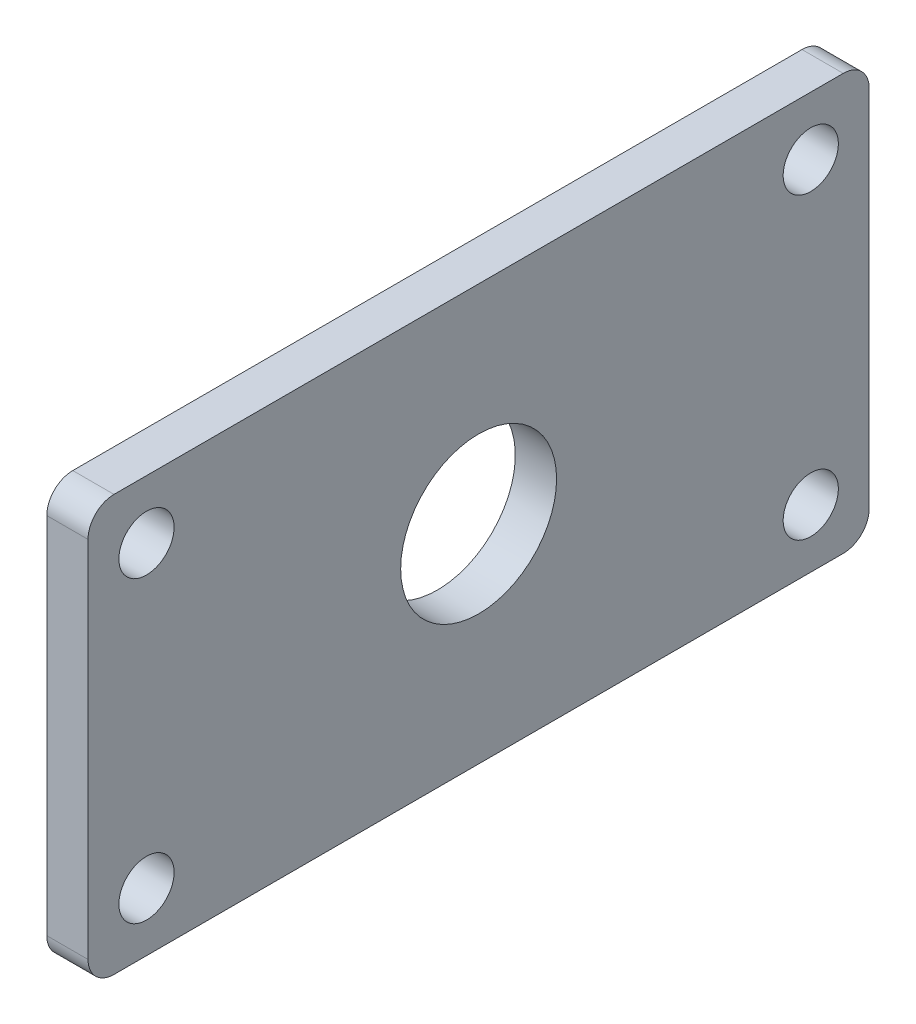
ISO-10303-21;
HEADER;
FILE_DESCRIPTION(('STEP AP214'),'2;1');
FILE_NAME('part.step','',(''),(''),'','','');
FILE_SCHEMA(('AUTOMOTIVE_DESIGN { 1 0 10303 214 1 1 1 1 }'));
ENDSEC;
DATA;
#1=APPLICATION_CONTEXT('core data for automotive mechanical design processes');
#2=APPLICATION_PROTOCOL_DEFINITION('international standard','automotive_design',2000,#1);
#3=PRODUCT_CONTEXT('',#1,'mechanical');
#4=PRODUCT('Part','Part','',(#3));
#5=PRODUCT_RELATED_PRODUCT_CATEGORY('part','',(#4));
#6=PRODUCT_DEFINITION_FORMATION('','',#4);
#7=PRODUCT_DEFINITION_CONTEXT('part definition',#1,'design');
#8=PRODUCT_DEFINITION('design','',#6,#7);
#9=PRODUCT_DEFINITION_SHAPE('','',#8);
#10=(LENGTH_UNIT() NAMED_UNIT(*) SI_UNIT(.MILLI.,.METRE.));
#11=(NAMED_UNIT(*) PLANE_ANGLE_UNIT() SI_UNIT($,.RADIAN.));
#12=(NAMED_UNIT(*) SI_UNIT($,.STERADIAN.) SOLID_ANGLE_UNIT());
#13=UNCERTAINTY_MEASURE_WITH_UNIT(LENGTH_MEASURE(1.E-05),#10,'distance_accuracy_value','');
#14=(GEOMETRIC_REPRESENTATION_CONTEXT(3) GLOBAL_UNCERTAINTY_ASSIGNED_CONTEXT((#13)) GLOBAL_UNIT_ASSIGNED_CONTEXT((#10,
#11,#12)) REPRESENTATION_CONTEXT('',''));
#15=CARTESIAN_POINT('',(0.,0.,0.));
#16=DIRECTION('',(0.,0.,1.));
#17=DIRECTION('',(1.,0.,0.));
#18=AXIS2_PLACEMENT_3D('',#15,#16,#17);
#19=CARTESIAN_POINT('',(44.075,0.,30.0625));
#20=DIRECTION('',(1.,0.,0.));
#21=DIRECTION('',(0.,0.,-1.));
#22=AXIS2_PLACEMENT_3D('',#19,#20,#21);
#23=PLANE('',#22);
#24=CARTESIAN_POINT('',(44.075,0.,0.));
#25=DIRECTION('',(1.,0.,0.));
#26=DIRECTION('',(0.,0.,-1.));
#27=AXIS2_PLACEMENT_3D('',#24,#25,#26);
#28=CIRCLE('',#27,6.);
#29=CARTESIAN_POINT('',(44.075,0.,-6.));
#30=VERTEX_POINT('',#29);
#31=EDGE_CURVE('E176',#30,#30,#28,.T.);
#32=ORIENTED_EDGE('',*,*,#31,.F.);
#33=EDGE_LOOP('',(#32));
#34=FACE_BOUND('',#33,.T.);
#35=CARTESIAN_POINT('',(44.075,-11.5,25.5625));
#36=DIRECTION('',(1.,0.,0.));
#37=DIRECTION('',(0.,0.,-1.));
#38=AXIS2_PLACEMENT_3D('',#35,#36,#37);
#39=CIRCLE('',#38,2.125);
#40=CARTESIAN_POINT('',(44.075,-11.5,23.4375));
#41=VERTEX_POINT('',#40);
#42=EDGE_CURVE('E267',#41,#41,#39,.T.);
#43=ORIENTED_EDGE('',*,*,#42,.F.);
#44=EDGE_LOOP('',(#43));
#45=FACE_BOUND('',#44,.T.);
#46=CARTESIAN_POINT('',(44.075,-11.5,-25.5625));
#47=DIRECTION('',(1.,0.,0.));
#48=DIRECTION('',(0.,0.,-1.));
#49=AXIS2_PLACEMENT_3D('',#46,#47,#48);
#50=CIRCLE('',#49,2.125);
#51=CARTESIAN_POINT('',(44.075,-11.5,-27.6875));
#52=VERTEX_POINT('',#51);
#53=EDGE_CURVE('E264',#52,#52,#50,.T.);
#54=ORIENTED_EDGE('',*,*,#53,.F.);
#55=EDGE_LOOP('',(#54));
#56=FACE_BOUND('',#55,.T.);
#57=CARTESIAN_POINT('',(44.075,11.5,-25.5625));
#58=DIRECTION('',(1.,0.,0.));
#59=DIRECTION('',(0.,0.,-1.));
#60=AXIS2_PLACEMENT_3D('',#57,#58,#59);
#61=CIRCLE('',#60,2.12500000000001);
#62=CARTESIAN_POINT('',(44.075,11.5,-27.6875));
#63=VERTEX_POINT('',#62);
#64=EDGE_CURVE('E241',#63,#63,#61,.T.);
#65=ORIENTED_EDGE('',*,*,#64,.F.);
#66=EDGE_LOOP('',(#65));
#67=FACE_BOUND('',#66,.T.);
#68=CARTESIAN_POINT('',(44.075,11.5,25.5625));
#69=DIRECTION('',(1.,0.,0.));
#70=DIRECTION('',(0.,0.,-1.));
#71=AXIS2_PLACEMENT_3D('',#68,#69,#70);
#72=CIRCLE('',#71,2.125);
#73=CARTESIAN_POINT('',(44.075,11.5,23.4375));
#74=VERTEX_POINT('',#73);
#75=EDGE_CURVE('E250',#74,#74,#72,.T.);
#76=ORIENTED_EDGE('',*,*,#75,.F.);
#77=EDGE_LOOP('',(#76));
#78=FACE_BOUND('',#77,.T.);
#79=DIRECTION('',(0.,-1.,0.));
#80=VECTOR('',#79,1.);
#81=CARTESIAN_POINT('',(44.075,0.,30.0625));
#82=LINE('',#81,#80);
#83=CARTESIAN_POINT('',(44.075,14.,30.0625));
#84=VERTEX_POINT('',#83);
#85=CARTESIAN_POINT('',(44.075,-14.,30.0625));
#86=VERTEX_POINT('',#85);
#87=EDGE_CURVE('E172',#84,#86,#82,.T.);
#88=ORIENTED_EDGE('',*,*,#87,.T.);
#89=CARTESIAN_POINT('',(44.075,-14.,28.0625));
#90=DIRECTION('',(1.,0.,0.));
#91=DIRECTION('',(0.,0.,-1.));
#92=AXIS2_PLACEMENT_3D('',#89,#90,#91);
#93=CIRCLE('',#92,2.);
#94=CARTESIAN_POINT('',(44.075,-16.,28.0625));
#95=VERTEX_POINT('',#94);
#96=EDGE_CURVE('E156',#86,#95,#93,.T.);
#97=ORIENTED_EDGE('',*,*,#96,.T.);
#98=DIRECTION('',(0.,0.,-1.));
#99=VECTOR('',#98,1.);
#100=CARTESIAN_POINT('',(44.075,-16.,30.0625));
#101=LINE('',#100,#99);
#102=CARTESIAN_POINT('',(44.075,-16.,-28.0625));
#103=VERTEX_POINT('',#102);
#104=EDGE_CURVE('E127',#95,#103,#101,.T.);
#105=ORIENTED_EDGE('',*,*,#104,.T.);
#106=CARTESIAN_POINT('',(44.075,-14.,-28.0625));
#107=DIRECTION('',(1.,0.,0.));
#108=DIRECTION('',(0.,0.,-1.));
#109=AXIS2_PLACEMENT_3D('',#106,#107,#108);
#110=CIRCLE('',#109,2.);
#111=CARTESIAN_POINT('',(44.075,-14.,-30.0625));
#112=VERTEX_POINT('',#111);
#113=EDGE_CURVE('E154',#103,#112,#110,.T.);
#114=ORIENTED_EDGE('',*,*,#113,.T.);
#115=DIRECTION('',(0.,-1.,0.));
#116=VECTOR('',#115,1.);
#117=CARTESIAN_POINT('',(44.075,0.,-30.0625));
#118=LINE('',#117,#116);
#119=CARTESIAN_POINT('',(44.075,14.,-30.0625));
#120=VERTEX_POINT('',#119);
#121=EDGE_CURVE('E169',#120,#112,#118,.T.);
#122=ORIENTED_EDGE('',*,*,#121,.F.);
#123=CARTESIAN_POINT('',(44.075,14.,-28.0625));
#124=DIRECTION('',(1.,0.,0.));
#125=DIRECTION('',(0.,0.,-1.));
#126=AXIS2_PLACEMENT_3D('',#123,#124,#125);
#127=CIRCLE('',#126,2.);
#128=CARTESIAN_POINT('',(44.075,16.,-28.0625));
#129=VERTEX_POINT('',#128);
#130=EDGE_CURVE('E56',#120,#129,#127,.T.);
#131=ORIENTED_EDGE('',*,*,#130,.T.);
#132=DIRECTION('',(0.,0.,-1.));
#133=VECTOR('',#132,1.);
#134=CARTESIAN_POINT('',(44.075,16.,30.0625));
#135=LINE('',#134,#133);
#136=CARTESIAN_POINT('',(44.075,16.,28.0625));
#137=VERTEX_POINT('',#136);
#138=EDGE_CURVE('E136',#137,#129,#135,.T.);
#139=ORIENTED_EDGE('',*,*,#138,.F.);
#140=CARTESIAN_POINT('',(44.075,14.,28.0625));
#141=DIRECTION('',(1.,0.,0.));
#142=DIRECTION('',(0.,0.,-1.));
#143=AXIS2_PLACEMENT_3D('',#140,#141,#142);
#144=CIRCLE('',#143,2.);
#145=EDGE_CURVE('E151',#137,#84,#144,.T.);
#146=ORIENTED_EDGE('',*,*,#145,.T.);
#147=EDGE_LOOP('',(#88,#97,#105,#114,#122,#131,#139,#146));
#148=FACE_BOUND('',#147,.T.);
#149=ADVANCED_FACE('F41',(#34,#45,#56,#67,#78,#148),#23,.T.);
#150=CARTESIAN_POINT('',(0.,16.,30.0625));
#151=DIRECTION('',(0.,-1.,0.));
#152=DIRECTION('',(0.,0.,-1.));
#153=AXIS2_PLACEMENT_3D('',#150,#151,#152);
#154=PLANE('',#153);
#155=ORIENTED_EDGE('',*,*,#138,.T.);
#156=DIRECTION('',(-1.,0.,0.));
#157=VECTOR('',#156,1.);
#158=CARTESIAN_POINT('',(0.,16.,-28.0625));
#159=LINE('',#158,#157);
#160=CARTESIAN_POINT('',(40.9,16.,-28.0625));
#161=VERTEX_POINT('',#160);
#162=EDGE_CURVE('E11',#129,#161,#159,.T.);
#163=ORIENTED_EDGE('',*,*,#162,.T.);
#164=DIRECTION('',(0.,0.,-1.));
#165=VECTOR('',#164,1.);
#166=CARTESIAN_POINT('',(40.9,16.,30.0625));
#167=LINE('',#166,#165);
#168=CARTESIAN_POINT('',(40.9,16.,28.0625));
#169=VERTEX_POINT('',#168);
#170=EDGE_CURVE('E133',#169,#161,#167,.T.);
#171=ORIENTED_EDGE('',*,*,#170,.F.);
#172=DIRECTION('',(-1.,0.,0.));
#173=VECTOR('',#172,1.);
#174=CARTESIAN_POINT('',(44.075,16.,28.0625));
#175=LINE('',#174,#173);
#176=EDGE_CURVE('E49',#169,#137,#175,.F.);
#177=ORIENTED_EDGE('',*,*,#176,.T.);
#178=EDGE_LOOP('',(#155,#163,#171,#177));
#179=FACE_BOUND('',#178,.T.);
#180=ADVANCED_FACE('F184',(#179),#154,.F.);
#181=CARTESIAN_POINT('',(40.9,0.,30.0625));
#182=DIRECTION('',(1.,0.,0.));
#183=DIRECTION('',(0.,0.,-1.));
#184=AXIS2_PLACEMENT_3D('',#181,#182,#183);
#185=PLANE('',#184);
#186=CARTESIAN_POINT('',(40.9,0.,0.));
#187=DIRECTION('',(-1.,0.,0.));
#188=DIRECTION('',(0.,0.,1.));
#189=AXIS2_PLACEMENT_3D('',#186,#187,#188);
#190=CIRCLE('',#189,6.);
#191=CARTESIAN_POINT('',(40.9,0.,6.));
#192=VERTEX_POINT('',#191);
#193=EDGE_CURVE('E258',#192,#192,#190,.T.);
#194=ORIENTED_EDGE('',*,*,#193,.F.);
#195=EDGE_LOOP('',(#194));
#196=FACE_BOUND('',#195,.T.);
#197=CARTESIAN_POINT('',(40.9,-11.5,25.5625));
#198=DIRECTION('',(-1.,0.,0.));
#199=DIRECTION('',(0.,0.,1.));
#200=AXIS2_PLACEMENT_3D('',#197,#198,#199);
#201=CIRCLE('',#200,2.125);
#202=CARTESIAN_POINT('',(40.9,-11.5,27.6875));
#203=VERTEX_POINT('',#202);
#204=EDGE_CURVE('E253',#203,#203,#201,.T.);
#205=ORIENTED_EDGE('',*,*,#204,.F.);
#206=EDGE_LOOP('',(#205));
#207=FACE_BOUND('',#206,.T.);
#208=CARTESIAN_POINT('',(40.9,-11.5,-25.5625));
#209=DIRECTION('',(-1.,0.,0.));
#210=DIRECTION('',(0.,0.,1.));
#211=AXIS2_PLACEMENT_3D('',#208,#209,#210);
#212=CIRCLE('',#211,2.125);
#213=CARTESIAN_POINT('',(40.9,-11.5,-23.4375));
#214=VERTEX_POINT('',#213);
#215=EDGE_CURVE('E247',#214,#214,#212,.T.);
#216=ORIENTED_EDGE('',*,*,#215,.F.);
#217=EDGE_LOOP('',(#216));
#218=FACE_BOUND('',#217,.T.);
#219=CARTESIAN_POINT('',(40.9,11.5,-25.5625));
#220=DIRECTION('',(-1.,0.,0.));
#221=DIRECTION('',(0.,0.,1.));
#222=AXIS2_PLACEMENT_3D('',#219,#220,#221);
#223=CIRCLE('',#222,2.12500000000001);
#224=CARTESIAN_POINT('',(40.9,11.5,-23.4375));
#225=VERTEX_POINT('',#224);
#226=EDGE_CURVE('E244',#225,#225,#223,.T.);
#227=ORIENTED_EDGE('',*,*,#226,.F.);
#228=EDGE_LOOP('',(#227));
#229=FACE_BOUND('',#228,.T.);
#230=CARTESIAN_POINT('',(40.9,11.5,25.5625));
#231=DIRECTION('',(-1.,0.,0.));
#232=DIRECTION('',(0.,0.,1.));
#233=AXIS2_PLACEMENT_3D('',#230,#231,#232);
#234=CIRCLE('',#233,2.125);
#235=CARTESIAN_POINT('',(40.9,11.5,27.6875));
#236=VERTEX_POINT('',#235);
#237=EDGE_CURVE('E246',#236,#236,#234,.T.);
#238=ORIENTED_EDGE('',*,*,#237,.F.);
#239=EDGE_LOOP('',(#238));
#240=FACE_BOUND('',#239,.T.);
#241=DIRECTION('',(0.,0.,-1.));
#242=VECTOR('',#241,1.);
#243=CARTESIAN_POINT('',(40.9,-16.,30.0625));
#244=LINE('',#243,#242);
#245=CARTESIAN_POINT('',(40.9,-16.,28.0625));
#246=VERTEX_POINT('',#245);
#247=CARTESIAN_POINT('',(40.9,-16.,-28.0625));
#248=VERTEX_POINT('',#247);
#249=EDGE_CURVE('E124',#246,#248,#244,.T.);
#250=ORIENTED_EDGE('',*,*,#249,.F.);
#251=CARTESIAN_POINT('',(40.9,-14.,28.0625));
#252=DIRECTION('',(1.,0.,0.));
#253=DIRECTION('',(0.,0.,-1.));
#254=AXIS2_PLACEMENT_3D('',#251,#252,#253);
#255=CIRCLE('',#254,2.);
#256=CARTESIAN_POINT('',(40.9,-14.,30.0625));
#257=VERTEX_POINT('',#256);
#258=EDGE_CURVE('E107',#246,#257,#255,.F.);
#259=ORIENTED_EDGE('',*,*,#258,.T.);
#260=DIRECTION('',(0.,-1.,0.));
#261=VECTOR('',#260,1.);
#262=CARTESIAN_POINT('',(40.9,0.,30.0625));
#263=LINE('',#262,#261);
#264=CARTESIAN_POINT('',(40.9,14.,30.0625));
#265=VERTEX_POINT('',#264);
#266=EDGE_CURVE('E138',#265,#257,#263,.T.);
#267=ORIENTED_EDGE('',*,*,#266,.F.);
#268=CARTESIAN_POINT('',(40.9,14.,28.0625));
#269=DIRECTION('',(1.,0.,0.));
#270=DIRECTION('',(0.,0.,-1.));
#271=AXIS2_PLACEMENT_3D('',#268,#269,#270);
#272=CIRCLE('',#271,2.);
#273=EDGE_CURVE('E128',#265,#169,#272,.F.);
#274=ORIENTED_EDGE('',*,*,#273,.T.);
#275=ORIENTED_EDGE('',*,*,#170,.T.);
#276=CARTESIAN_POINT('',(40.9,14.,-28.0625));
#277=DIRECTION('',(1.,0.,0.));
#278=DIRECTION('',(0.,0.,-1.));
#279=AXIS2_PLACEMENT_3D('',#276,#277,#278);
#280=CIRCLE('',#279,2.);
#281=CARTESIAN_POINT('',(40.9,14.,-30.0625));
#282=VERTEX_POINT('',#281);
#283=EDGE_CURVE('E145',#161,#282,#280,.F.);
#284=ORIENTED_EDGE('',*,*,#283,.T.);
#285=DIRECTION('',(0.,-1.,0.));
#286=VECTOR('',#285,1.);
#287=CARTESIAN_POINT('',(40.9,0.,-30.0625));
#288=LINE('',#287,#286);
#289=CARTESIAN_POINT('',(40.9,-14.,-30.0625));
#290=VERTEX_POINT('',#289);
#291=EDGE_CURVE('E167',#282,#290,#288,.T.);
#292=ORIENTED_EDGE('',*,*,#291,.T.);
#293=CARTESIAN_POINT('',(40.9,-14.,-28.0625));
#294=DIRECTION('',(1.,0.,0.));
#295=DIRECTION('',(0.,0.,-1.));
#296=AXIS2_PLACEMENT_3D('',#293,#294,#295);
#297=CIRCLE('',#296,2.);
#298=EDGE_CURVE('E118',#290,#248,#297,.F.);
#299=ORIENTED_EDGE('',*,*,#298,.T.);
#300=EDGE_LOOP('',(#250,#259,#267,#274,#275,#284,#292,#299));
#301=FACE_BOUND('',#300,.T.);
#302=ADVANCED_FACE('F131',(#196,#207,#218,#229,#240,#301),#185,.F.);
#303=CARTESIAN_POINT('',(0.,-16.,30.0625));
#304=DIRECTION('',(0.,-1.,0.));
#305=DIRECTION('',(0.,0.,-1.));
#306=AXIS2_PLACEMENT_3D('',#303,#304,#305);
#307=PLANE('',#306);
#308=ORIENTED_EDGE('',*,*,#104,.F.);
#309=DIRECTION('',(-1.,0.,0.));
#310=VECTOR('',#309,1.);
#311=CARTESIAN_POINT('',(0.,-16.,28.0625));
#312=LINE('',#311,#310);
#313=EDGE_CURVE('E111',#95,#246,#312,.T.);
#314=ORIENTED_EDGE('',*,*,#313,.T.);
#315=ORIENTED_EDGE('',*,*,#249,.T.);
#316=DIRECTION('',(-1.,0.,0.));
#317=VECTOR('',#316,1.);
#318=CARTESIAN_POINT('',(44.075,-16.,-28.0625));
#319=LINE('',#318,#317);
#320=EDGE_CURVE('E129',#248,#103,#319,.F.);
#321=ORIENTED_EDGE('',*,*,#320,.T.);
#322=EDGE_LOOP('',(#308,#314,#315,#321));
#323=FACE_BOUND('',#322,.T.);
#324=ADVANCED_FACE('F123',(#323),#307,.T.);
#325=CARTESIAN_POINT('',(0.,0.,30.0625));
#326=DIRECTION('',(0.,0.,1.));
#327=DIRECTION('',(1.,0.,0.));
#328=AXIS2_PLACEMENT_3D('',#325,#326,#327);
#329=PLANE('',#328);
#330=ORIENTED_EDGE('',*,*,#266,.T.);
#331=DIRECTION('',(-1.,0.,0.));
#332=VECTOR('',#331,1.);
#333=CARTESIAN_POINT('',(0.,-14.,30.0625));
#334=LINE('',#333,#332);
#335=EDGE_CURVE('E112',#257,#86,#334,.F.);
#336=ORIENTED_EDGE('',*,*,#335,.T.);
#337=ORIENTED_EDGE('',*,*,#87,.F.);
#338=DIRECTION('',(-1.,0.,0.));
#339=VECTOR('',#338,1.);
#340=CARTESIAN_POINT('',(40.9,14.,30.0625));
#341=LINE('',#340,#339);
#342=EDGE_CURVE('E117',#84,#265,#341,.T.);
#343=ORIENTED_EDGE('',*,*,#342,.T.);
#344=EDGE_LOOP('',(#330,#336,#337,#343));
#345=FACE_BOUND('',#344,.T.);
#346=ADVANCED_FACE('F180',(#345),#329,.T.);
#347=CARTESIAN_POINT('',(0.,0.,-30.0625));
#348=DIRECTION('',(0.,0.,1.));
#349=DIRECTION('',(1.,0.,0.));
#350=AXIS2_PLACEMENT_3D('',#347,#348,#349);
#351=PLANE('',#350);
#352=ORIENTED_EDGE('',*,*,#121,.T.);
#353=DIRECTION('',(-1.,0.,0.));
#354=VECTOR('',#353,1.);
#355=CARTESIAN_POINT('',(40.9,-14.,-30.0625));
#356=LINE('',#355,#354);
#357=EDGE_CURVE('E160',#112,#290,#356,.T.);
#358=ORIENTED_EDGE('',*,*,#357,.T.);
#359=ORIENTED_EDGE('',*,*,#291,.F.);
#360=DIRECTION('',(-1.,0.,0.));
#361=VECTOR('',#360,1.);
#362=CARTESIAN_POINT('',(0.,14.,-30.0625));
#363=LINE('',#362,#361);
#364=EDGE_CURVE('E158',#282,#120,#363,.F.);
#365=ORIENTED_EDGE('',*,*,#364,.T.);
#366=EDGE_LOOP('',(#352,#358,#359,#365));
#367=FACE_BOUND('',#366,.T.);
#368=ADVANCED_FACE('F166',(#367),#351,.F.);
#369=CARTESIAN_POINT('',(0.,-14.,28.0625));
#370=DIRECTION('',(-1.,0.,0.));
#371=DIRECTION('',(0.,0.,1.));
#372=AXIS2_PLACEMENT_3D('',#369,#370,#371);
#373=CYLINDRICAL_SURFACE('',#372,2.);
#374=ORIENTED_EDGE('',*,*,#96,.F.);
#375=ORIENTED_EDGE('',*,*,#335,.F.);
#376=ORIENTED_EDGE('',*,*,#258,.F.);
#377=ORIENTED_EDGE('',*,*,#313,.F.);
#378=EDGE_LOOP('',(#374,#375,#376,#377));
#379=FACE_BOUND('',#378,.T.);
#380=ADVANCED_FACE('F110',(#379),#373,.T.);
#381=CARTESIAN_POINT('',(0.,-14.,-28.0625));
#382=DIRECTION('',(1.,0.,0.));
#383=DIRECTION('',(0.,0.,-1.));
#384=AXIS2_PLACEMENT_3D('',#381,#382,#383);
#385=CYLINDRICAL_SURFACE('',#384,2.);
#386=ORIENTED_EDGE('',*,*,#113,.F.);
#387=ORIENTED_EDGE('',*,*,#320,.F.);
#388=ORIENTED_EDGE('',*,*,#298,.F.);
#389=ORIENTED_EDGE('',*,*,#357,.F.);
#390=EDGE_LOOP('',(#386,#387,#388,#389));
#391=FACE_BOUND('',#390,.T.);
#392=ADVANCED_FACE('F189',(#391),#385,.T.);
#393=CARTESIAN_POINT('',(0.,14.,-28.0625));
#394=DIRECTION('',(-1.,0.,0.));
#395=DIRECTION('',(0.,0.,1.));
#396=AXIS2_PLACEMENT_3D('',#393,#394,#395);
#397=CYLINDRICAL_SURFACE('',#396,2.);
#398=ORIENTED_EDGE('',*,*,#130,.F.);
#399=ORIENTED_EDGE('',*,*,#364,.F.);
#400=ORIENTED_EDGE('',*,*,#283,.F.);
#401=ORIENTED_EDGE('',*,*,#162,.F.);
#402=EDGE_LOOP('',(#398,#399,#400,#401));
#403=FACE_BOUND('',#402,.T.);
#404=ADVANCED_FACE('F188',(#403),#397,.T.);
#405=CARTESIAN_POINT('',(0.,14.,28.0625));
#406=DIRECTION('',(1.,0.,0.));
#407=DIRECTION('',(0.,0.,-1.));
#408=AXIS2_PLACEMENT_3D('',#405,#406,#407);
#409=CYLINDRICAL_SURFACE('',#408,2.);
#410=ORIENTED_EDGE('',*,*,#145,.F.);
#411=ORIENTED_EDGE('',*,*,#176,.F.);
#412=ORIENTED_EDGE('',*,*,#273,.F.);
#413=ORIENTED_EDGE('',*,*,#342,.F.);
#414=EDGE_LOOP('',(#410,#411,#412,#413));
#415=FACE_BOUND('',#414,.T.);
#416=ADVANCED_FACE('F43',(#415),#409,.T.);
#417=CARTESIAN_POINT('',(50.9,11.5,25.5625));
#418=DIRECTION('',(-1.,0.,0.));
#419=DIRECTION('',(0.,0.,1.));
#420=AXIS2_PLACEMENT_3D('',#417,#418,#419);
#421=CYLINDRICAL_SURFACE('',#420,2.125);
#422=ORIENTED_EDGE('',*,*,#75,.T.);
#423=EDGE_LOOP('',(#422));
#424=FACE_BOUND('',#423,.T.);
#425=ORIENTED_EDGE('',*,*,#237,.T.);
#426=EDGE_LOOP('',(#425));
#427=FACE_BOUND('',#426,.T.);
#428=ADVANCED_FACE('F217',(#424,#427),#421,.F.);
#429=CARTESIAN_POINT('',(50.9,11.5,-25.5625));
#430=DIRECTION('',(-1.,0.,0.));
#431=DIRECTION('',(0.,0.,1.));
#432=AXIS2_PLACEMENT_3D('',#429,#430,#431);
#433=CYLINDRICAL_SURFACE('',#432,2.12500000000001);
#434=ORIENTED_EDGE('',*,*,#64,.T.);
#435=EDGE_LOOP('',(#434));
#436=FACE_BOUND('',#435,.T.);
#437=ORIENTED_EDGE('',*,*,#226,.T.);
#438=EDGE_LOOP('',(#437));
#439=FACE_BOUND('',#438,.T.);
#440=ADVANCED_FACE('F220',(#436,#439),#433,.F.);
#441=CARTESIAN_POINT('',(50.9,-11.5,-25.5625));
#442=DIRECTION('',(-1.,0.,0.));
#443=DIRECTION('',(0.,0.,1.));
#444=AXIS2_PLACEMENT_3D('',#441,#442,#443);
#445=CYLINDRICAL_SURFACE('',#444,2.125);
#446=ORIENTED_EDGE('',*,*,#53,.T.);
#447=EDGE_LOOP('',(#446));
#448=FACE_BOUND('',#447,.T.);
#449=ORIENTED_EDGE('',*,*,#215,.T.);
#450=EDGE_LOOP('',(#449));
#451=FACE_BOUND('',#450,.T.);
#452=ADVANCED_FACE('F229',(#448,#451),#445,.F.);
#453=CARTESIAN_POINT('',(50.9,-11.5,25.5625));
#454=DIRECTION('',(-1.,0.,0.));
#455=DIRECTION('',(0.,0.,1.));
#456=AXIS2_PLACEMENT_3D('',#453,#454,#455);
#457=CYLINDRICAL_SURFACE('',#456,2.125);
#458=ORIENTED_EDGE('',*,*,#42,.T.);
#459=EDGE_LOOP('',(#458));
#460=FACE_BOUND('',#459,.T.);
#461=ORIENTED_EDGE('',*,*,#204,.T.);
#462=EDGE_LOOP('',(#461));
#463=FACE_BOUND('',#462,.T.);
#464=ADVANCED_FACE('F225',(#460,#463),#457,.F.);
#465=CARTESIAN_POINT('',(50.9,0.,0.));
#466=DIRECTION('',(-1.,0.,0.));
#467=DIRECTION('',(0.,0.,1.));
#468=AXIS2_PLACEMENT_3D('',#465,#466,#467);
#469=CYLINDRICAL_SURFACE('',#468,6.);
#470=ORIENTED_EDGE('',*,*,#31,.T.);
#471=EDGE_LOOP('',(#470));
#472=FACE_BOUND('',#471,.T.);
#473=ORIENTED_EDGE('',*,*,#193,.T.);
#474=EDGE_LOOP('',(#473));
#475=FACE_BOUND('',#474,.T.);
#476=ADVANCED_FACE('F222',(#472,#475),#469,.F.);
#477=CLOSED_SHELL('',(#149,#180,#302,#324,#346,#368,#380,#392,#404,#416,#428,#440,#452,#464,#476));
#478=MANIFOLD_SOLID_BREP('B2',#477);
#479=ADVANCED_BREP_SHAPE_REPRESENTATION('',(#18,#478),#14);
#480=SHAPE_DEFINITION_REPRESENTATION(#9,#479);
ENDSEC;
END-ISO-10303-21;
